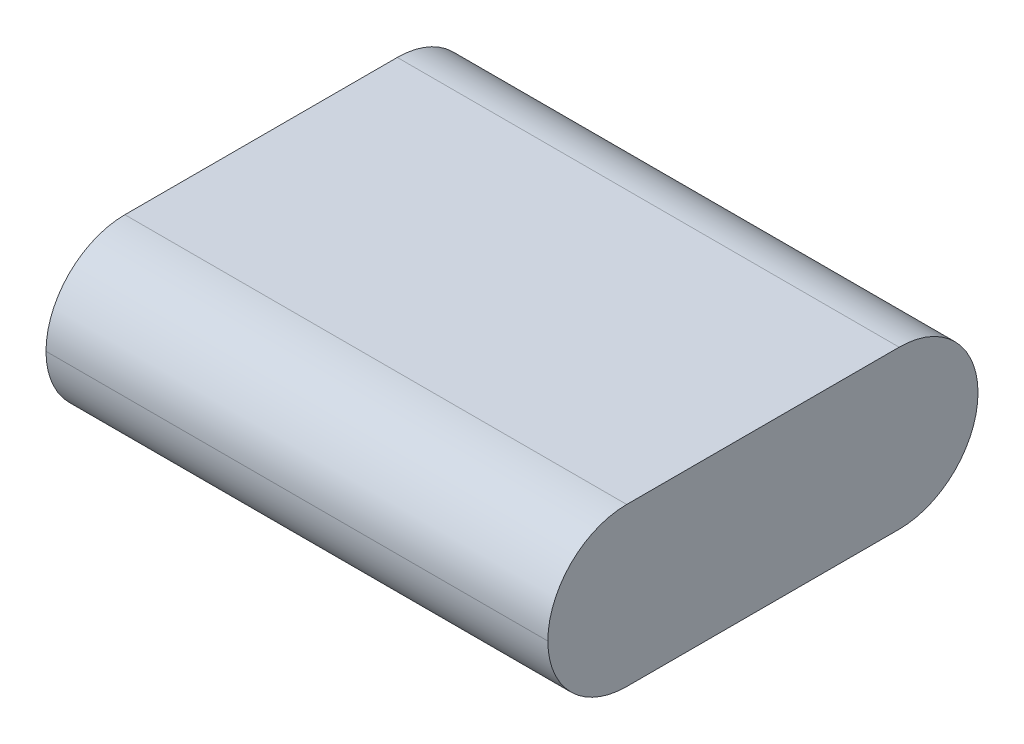
ISO-10303-21;
HEADER;
FILE_DESCRIPTION(('STEP AP214'),'2;1');
FILE_NAME('part.step','',(''),(''),'','','');
FILE_SCHEMA(('AUTOMOTIVE_DESIGN { 1 0 10303 214 1 1 1 1 }'));
ENDSEC;
DATA;
#1=APPLICATION_CONTEXT('core data for automotive mechanical design processes');
#2=APPLICATION_PROTOCOL_DEFINITION('international standard','automotive_design',2000,#1);
#3=PRODUCT_CONTEXT('',#1,'mechanical');
#4=PRODUCT('Part','Part','',(#3));
#5=PRODUCT_RELATED_PRODUCT_CATEGORY('part','',(#4));
#6=PRODUCT_DEFINITION_FORMATION('','',#4);
#7=PRODUCT_DEFINITION_CONTEXT('part definition',#1,'design');
#8=PRODUCT_DEFINITION('design','',#6,#7);
#9=PRODUCT_DEFINITION_SHAPE('','',#8);
#10=(LENGTH_UNIT() NAMED_UNIT(*) SI_UNIT(.MILLI.,.METRE.));
#11=(NAMED_UNIT(*) PLANE_ANGLE_UNIT() SI_UNIT($,.RADIAN.));
#12=(NAMED_UNIT(*) SI_UNIT($,.STERADIAN.) SOLID_ANGLE_UNIT());
#13=UNCERTAINTY_MEASURE_WITH_UNIT(LENGTH_MEASURE(1.E-05),#10,'distance_accuracy_value','');
#14=(GEOMETRIC_REPRESENTATION_CONTEXT(3) GLOBAL_UNCERTAINTY_ASSIGNED_CONTEXT((#13)) GLOBAL_UNIT_ASSIGNED_CONTEXT((#10,
#11,#12)) REPRESENTATION_CONTEXT('',''));
#15=CARTESIAN_POINT('',(0.,0.,0.));
#16=DIRECTION('',(0.,0.,1.));
#17=DIRECTION('',(1.,0.,0.));
#18=AXIS2_PLACEMENT_3D('',#15,#16,#17);
#19=CARTESIAN_POINT('',(-35.,22.,30.));
#20=DIRECTION('',(-1.,0.,0.));
#21=DIRECTION('',(0.,0.,1.));
#22=AXIS2_PLACEMENT_3D('',#19,#20,#21);
#23=PLANE('',#22);
#24=CARTESIAN_POINT('',(-35.,11.,-19.));
#25=DIRECTION('',(-1.,0.,0.));
#26=DIRECTION('',(0.,0.,1.));
#27=AXIS2_PLACEMENT_3D('',#24,#25,#26);
#28=CIRCLE('',#27,11.);
#29=CARTESIAN_POINT('',(-35.,22.,-19.));
#30=VERTEX_POINT('',#29);
#31=CARTESIAN_POINT('',(-35.,11.,-30.));
#32=VERTEX_POINT('',#31);
#33=EDGE_CURVE('E51',#30,#32,#28,.T.);
#34=ORIENTED_EDGE('',*,*,#33,.T.);
#35=CARTESIAN_POINT('',(-35.,11.,-19.));
#36=DIRECTION('',(-1.,0.,0.));
#37=DIRECTION('',(0.,0.,1.));
#38=AXIS2_PLACEMENT_3D('',#35,#36,#37);
#39=CIRCLE('',#38,11.);
#40=CARTESIAN_POINT('',(-35.,0.,-19.));
#41=VERTEX_POINT('',#40);
#42=EDGE_CURVE('E131',#32,#41,#39,.T.);
#43=ORIENTED_EDGE('',*,*,#42,.T.);
#44=DIRECTION('',(0.,0.,-1.));
#45=VECTOR('',#44,1.);
#46=CARTESIAN_POINT('',(-35.,0.,30.));
#47=LINE('',#46,#45);
#48=CARTESIAN_POINT('',(-35.,0.,19.));
#49=VERTEX_POINT('',#48);
#50=EDGE_CURVE('E111',#49,#41,#47,.T.);
#51=ORIENTED_EDGE('',*,*,#50,.F.);
#52=CARTESIAN_POINT('',(-35.,11.,19.));
#53=DIRECTION('',(-1.,0.,0.));
#54=DIRECTION('',(0.,0.,1.));
#55=AXIS2_PLACEMENT_3D('',#52,#53,#54);
#56=CIRCLE('',#55,11.);
#57=CARTESIAN_POINT('',(-35.,11.,30.));
#58=VERTEX_POINT('',#57);
#59=EDGE_CURVE('E115',#49,#58,#56,.T.);
#60=ORIENTED_EDGE('',*,*,#59,.T.);
#61=CARTESIAN_POINT('',(-35.,11.,19.));
#62=DIRECTION('',(-1.,0.,0.));
#63=DIRECTION('',(0.,0.,1.));
#64=AXIS2_PLACEMENT_3D('',#61,#62,#63);
#65=CIRCLE('',#64,11.);
#66=CARTESIAN_POINT('',(-35.,22.,19.));
#67=VERTEX_POINT('',#66);
#68=EDGE_CURVE('E127',#58,#67,#65,.T.);
#69=ORIENTED_EDGE('',*,*,#68,.T.);
#70=DIRECTION('',(0.,0.,-1.));
#71=VECTOR('',#70,1.);
#72=CARTESIAN_POINT('',(-35.,22.,30.));
#73=LINE('',#72,#71);
#74=EDGE_CURVE('E116',#67,#30,#73,.T.);
#75=ORIENTED_EDGE('',*,*,#74,.T.);
#76=EDGE_LOOP('',(#34,#43,#51,#60,#69,#75));
#77=FACE_BOUND('',#76,.T.);
#78=ADVANCED_FACE('F34',(#77),#23,.T.);
#79=CARTESIAN_POINT('',(35.,22.,30.));
#80=DIRECTION('',(-1.,0.,0.));
#81=DIRECTION('',(0.,0.,1.));
#82=AXIS2_PLACEMENT_3D('',#79,#80,#81);
#83=PLANE('',#82);
#84=DIRECTION('',(0.,0.,-1.));
#85=VECTOR('',#84,1.);
#86=CARTESIAN_POINT('',(35.,0.,30.));
#87=LINE('',#86,#85);
#88=CARTESIAN_POINT('',(35.,0.,19.));
#89=VERTEX_POINT('',#88);
#90=CARTESIAN_POINT('',(35.,0.,-19.));
#91=VERTEX_POINT('',#90);
#92=EDGE_CURVE('E92',#89,#91,#87,.T.);
#93=ORIENTED_EDGE('',*,*,#92,.T.);
#94=CARTESIAN_POINT('',(35.,11.,-19.));
#95=DIRECTION('',(-1.,0.,0.));
#96=DIRECTION('',(0.,0.,1.));
#97=AXIS2_PLACEMENT_3D('',#94,#95,#96);
#98=CIRCLE('',#97,11.);
#99=CARTESIAN_POINT('',(35.,11.,-30.));
#100=VERTEX_POINT('',#99);
#101=EDGE_CURVE('E125',#91,#100,#98,.F.);
#102=ORIENTED_EDGE('',*,*,#101,.T.);
#103=CARTESIAN_POINT('',(35.,11.,-19.));
#104=DIRECTION('',(-1.,0.,0.));
#105=DIRECTION('',(0.,0.,1.));
#106=AXIS2_PLACEMENT_3D('',#103,#104,#105);
#107=CIRCLE('',#106,11.);
#108=CARTESIAN_POINT('',(35.,22.,-19.));
#109=VERTEX_POINT('',#108);
#110=EDGE_CURVE('E100',#100,#109,#107,.F.);
#111=ORIENTED_EDGE('',*,*,#110,.T.);
#112=DIRECTION('',(0.,0.,-1.));
#113=VECTOR('',#112,1.);
#114=CARTESIAN_POINT('',(35.,22.,30.));
#115=LINE('',#114,#113);
#116=CARTESIAN_POINT('',(35.,22.,19.));
#117=VERTEX_POINT('',#116);
#118=EDGE_CURVE('E119',#117,#109,#115,.T.);
#119=ORIENTED_EDGE('',*,*,#118,.F.);
#120=CARTESIAN_POINT('',(35.,11.,19.));
#121=DIRECTION('',(-1.,0.,0.));
#122=DIRECTION('',(0.,0.,1.));
#123=AXIS2_PLACEMENT_3D('',#120,#121,#122);
#124=CIRCLE('',#123,11.);
#125=CARTESIAN_POINT('',(35.,11.,30.));
#126=VERTEX_POINT('',#125);
#127=EDGE_CURVE('E95',#117,#126,#124,.F.);
#128=ORIENTED_EDGE('',*,*,#127,.T.);
#129=CARTESIAN_POINT('',(35.,11.,19.));
#130=DIRECTION('',(-1.,0.,0.));
#131=DIRECTION('',(0.,0.,1.));
#132=AXIS2_PLACEMENT_3D('',#129,#130,#131);
#133=CIRCLE('',#132,11.);
#134=EDGE_CURVE('E89',#126,#89,#133,.F.);
#135=ORIENTED_EDGE('',*,*,#134,.T.);
#136=EDGE_LOOP('',(#93,#102,#111,#119,#128,#135));
#137=FACE_BOUND('',#136,.T.);
#138=ADVANCED_FACE('F91',(#137),#83,.F.);
#139=CARTESIAN_POINT('',(0.,22.,0.));
#140=DIRECTION('',(0.,1.,0.));
#141=DIRECTION('',(0.,0.,1.));
#142=AXIS2_PLACEMENT_3D('',#139,#140,#141);
#143=PLANE('',#142);
#144=ORIENTED_EDGE('',*,*,#118,.T.);
#145=DIRECTION('',(1.,0.,0.));
#146=VECTOR('',#145,1.);
#147=CARTESIAN_POINT('',(0.,22.,-19.));
#148=LINE('',#147,#146);
#149=EDGE_CURVE('E11',#109,#30,#148,.F.);
#150=ORIENTED_EDGE('',*,*,#149,.T.);
#151=ORIENTED_EDGE('',*,*,#74,.F.);
#152=DIRECTION('',(1.,0.,0.));
#153=VECTOR('',#152,1.);
#154=CARTESIAN_POINT('',(35.,22.,19.));
#155=LINE('',#154,#153);
#156=EDGE_CURVE('E43',#67,#117,#155,.T.);
#157=ORIENTED_EDGE('',*,*,#156,.T.);
#158=EDGE_LOOP('',(#144,#150,#151,#157));
#159=FACE_BOUND('',#158,.T.);
#160=ADVANCED_FACE('F139',(#159),#143,.T.);
#161=CARTESIAN_POINT('',(0.,0.,0.));
#162=DIRECTION('',(0.,1.,0.));
#163=DIRECTION('',(0.,0.,1.));
#164=AXIS2_PLACEMENT_3D('',#161,#162,#163);
#165=PLANE('',#164);
#166=ORIENTED_EDGE('',*,*,#50,.T.);
#167=DIRECTION('',(1.,0.,0.));
#168=VECTOR('',#167,1.);
#169=CARTESIAN_POINT('',(35.,0.,-19.));
#170=LINE('',#169,#168);
#171=EDGE_CURVE('E110',#41,#91,#170,.T.);
#172=ORIENTED_EDGE('',*,*,#171,.T.);
#173=ORIENTED_EDGE('',*,*,#92,.F.);
#174=DIRECTION('',(1.,0.,0.));
#175=VECTOR('',#174,1.);
#176=CARTESIAN_POINT('',(0.,0.,19.));
#177=LINE('',#176,#175);
#178=EDGE_CURVE('E107',#89,#49,#177,.F.);
#179=ORIENTED_EDGE('',*,*,#178,.T.);
#180=EDGE_LOOP('',(#166,#172,#173,#179));
#181=FACE_BOUND('',#180,.T.);
#182=ADVANCED_FACE('F106',(#181),#165,.F.);
#183=CARTESIAN_POINT('',(-35.,11.,-19.));
#184=DIRECTION('',(1.,0.,0.));
#185=DIRECTION('',(0.,0.,-1.));
#186=AXIS2_PLACEMENT_3D('',#183,#184,#185);
#187=CYLINDRICAL_SURFACE('',#186,11.);
#188=DIRECTION('',(1.,0.,0.));
#189=VECTOR('',#188,1.);
#190=CARTESIAN_POINT('',(-35.,11.,-30.));
#191=LINE('',#190,#189);
#192=EDGE_CURVE('E112',#32,#100,#191,.T.);
#193=ORIENTED_EDGE('',*,*,#192,.F.);
#194=ORIENTED_EDGE('',*,*,#33,.F.);
#195=ORIENTED_EDGE('',*,*,#149,.F.);
#196=ORIENTED_EDGE('',*,*,#110,.F.);
#197=EDGE_LOOP('',(#193,#194,#195,#196));
#198=FACE_BOUND('',#197,.T.);
#199=ADVANCED_FACE('F144',(#198),#187,.T.);
#200=CARTESIAN_POINT('',(0.,11.,-19.));
#201=DIRECTION('',(-1.,0.,0.));
#202=DIRECTION('',(0.,0.,1.));
#203=AXIS2_PLACEMENT_3D('',#200,#201,#202);
#204=CYLINDRICAL_SURFACE('',#203,11.);
#205=ORIENTED_EDGE('',*,*,#42,.F.);
#206=ORIENTED_EDGE('',*,*,#192,.T.);
#207=ORIENTED_EDGE('',*,*,#101,.F.);
#208=ORIENTED_EDGE('',*,*,#171,.F.);
#209=EDGE_LOOP('',(#205,#206,#207,#208));
#210=FACE_BOUND('',#209,.T.);
#211=ADVANCED_FACE('F142',(#210),#204,.T.);
#212=CARTESIAN_POINT('',(0.,11.,19.));
#213=DIRECTION('',(-1.,0.,0.));
#214=DIRECTION('',(0.,0.,1.));
#215=AXIS2_PLACEMENT_3D('',#212,#213,#214);
#216=CYLINDRICAL_SURFACE('',#215,11.);
#217=ORIENTED_EDGE('',*,*,#156,.F.);
#218=ORIENTED_EDGE('',*,*,#68,.F.);
#219=DIRECTION('',(1.,0.,0.));
#220=VECTOR('',#219,1.);
#221=CARTESIAN_POINT('',(-35.,11.,30.));
#222=LINE('',#221,#220);
#223=EDGE_CURVE('E38',#126,#58,#222,.F.);
#224=ORIENTED_EDGE('',*,*,#223,.F.);
#225=ORIENTED_EDGE('',*,*,#127,.F.);
#226=EDGE_LOOP('',(#217,#218,#224,#225));
#227=FACE_BOUND('',#226,.T.);
#228=ADVANCED_FACE('F36',(#227),#216,.T.);
#229=CARTESIAN_POINT('',(-35.,11.,19.));
#230=DIRECTION('',(1.,0.,0.));
#231=DIRECTION('',(0.,0.,-1.));
#232=AXIS2_PLACEMENT_3D('',#229,#230,#231);
#233=CYLINDRICAL_SURFACE('',#232,11.);
#234=ORIENTED_EDGE('',*,*,#59,.F.);
#235=ORIENTED_EDGE('',*,*,#178,.F.);
#236=ORIENTED_EDGE('',*,*,#134,.F.);
#237=ORIENTED_EDGE('',*,*,#223,.T.);
#238=EDGE_LOOP('',(#234,#235,#236,#237));
#239=FACE_BOUND('',#238,.T.);
#240=ADVANCED_FACE('F114',(#239),#233,.T.);
#241=CLOSED_SHELL('',(#78,#138,#160,#182,#199,#211,#228,#240));
#242=MANIFOLD_SOLID_BREP('B2',#241);
#243=ADVANCED_BREP_SHAPE_REPRESENTATION('',(#18,#242),#14);
#244=SHAPE_DEFINITION_REPRESENTATION(#9,#243);
ENDSEC;
END-ISO-10303-21;
